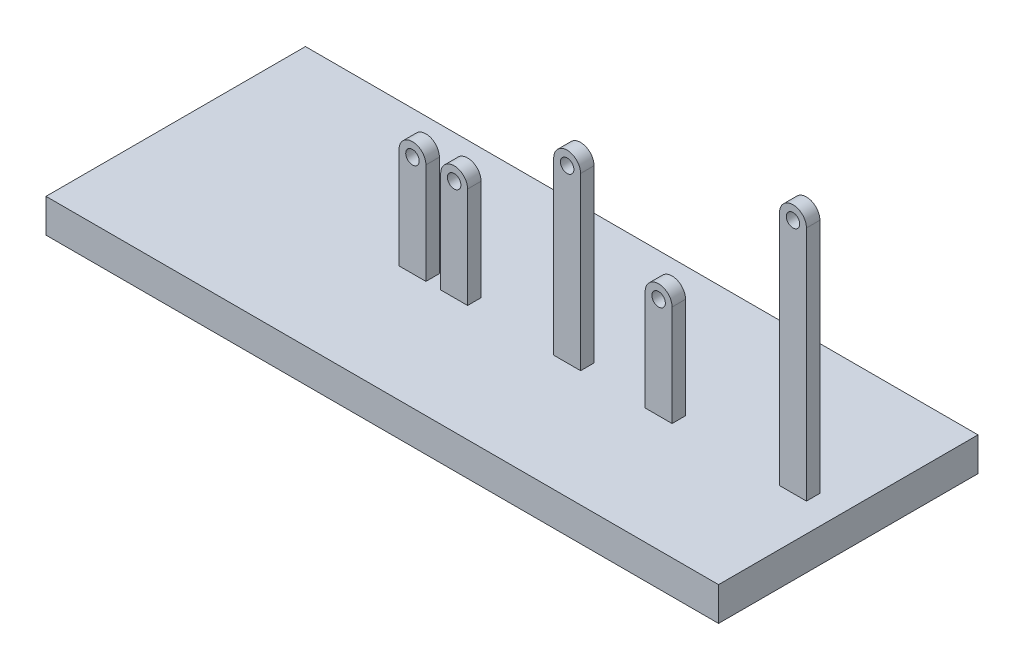
ISO-10303-21;
HEADER;
FILE_DESCRIPTION(('STEP AP214'),'2;1');
FILE_NAME('part.step','',(''),(''),'','','');
FILE_SCHEMA(('AUTOMOTIVE_DESIGN { 1 0 10303 214 1 1 1 1 }'));
ENDSEC;
DATA;
#1=APPLICATION_CONTEXT('core data for automotive mechanical design processes');
#2=APPLICATION_PROTOCOL_DEFINITION('international standard','automotive_design',2000,#1);
#3=PRODUCT_CONTEXT('',#1,'mechanical');
#4=PRODUCT('Part','Part','',(#3));
#5=PRODUCT_RELATED_PRODUCT_CATEGORY('part','',(#4));
#6=PRODUCT_DEFINITION_FORMATION('','',#4);
#7=PRODUCT_DEFINITION_CONTEXT('part definition',#1,'design');
#8=PRODUCT_DEFINITION('design','',#6,#7);
#9=PRODUCT_DEFINITION_SHAPE('','',#8);
#10=(LENGTH_UNIT() NAMED_UNIT(*) SI_UNIT(.MILLI.,.METRE.));
#11=(NAMED_UNIT(*) PLANE_ANGLE_UNIT() SI_UNIT($,.RADIAN.));
#12=(NAMED_UNIT(*) SI_UNIT($,.STERADIAN.) SOLID_ANGLE_UNIT());
#13=UNCERTAINTY_MEASURE_WITH_UNIT(LENGTH_MEASURE(1.E-05),#10,'distance_accuracy_value','');
#14=(GEOMETRIC_REPRESENTATION_CONTEXT(3) GLOBAL_UNCERTAINTY_ASSIGNED_CONTEXT((#13)) GLOBAL_UNIT_ASSIGNED_CONTEXT((#10,
#11,#12)) REPRESENTATION_CONTEXT('',''));
#15=CARTESIAN_POINT('',(0.,0.,0.));
#16=DIRECTION('',(0.,0.,1.));
#17=DIRECTION('',(1.,0.,0.));
#18=AXIS2_PLACEMENT_3D('',#15,#16,#17);
#19=CARTESIAN_POINT('',(0.,5.,0.));
#20=DIRECTION('',(0.,1.,0.));
#21=DIRECTION('',(0.,0.,1.));
#22=AXIS2_PLACEMENT_3D('',#19,#20,#21);
#23=PLANE('',#22);
#24=DIRECTION('',(0.,0.,1.));
#25=VECTOR('',#24,1.);
#26=CARTESIAN_POINT('',(-50.,5.,19.2879926320768));
#27=LINE('',#26,#25);
#28=CARTESIAN_POINT('',(-50.,5.,-19.2879926320768));
#29=VERTEX_POINT('',#28);
#30=CARTESIAN_POINT('',(-50.,5.,19.2879926320768));
#31=VERTEX_POINT('',#30);
#32=EDGE_CURVE('E390',#29,#31,#27,.T.);
#33=ORIENTED_EDGE('',*,*,#32,.T.);
#34=DIRECTION('',(1.,0.,0.));
#35=VECTOR('',#34,1.);
#36=CARTESIAN_POINT('',(50.,5.,19.2879926320768));
#37=LINE('',#36,#35);
#38=CARTESIAN_POINT('',(50.,5.,19.2879926320768));
#39=VERTEX_POINT('',#38);
#40=EDGE_CURVE('E393',#31,#39,#37,.T.);
#41=ORIENTED_EDGE('',*,*,#40,.T.);
#42=DIRECTION('',(0.,0.,-1.));
#43=VECTOR('',#42,1.);
#44=CARTESIAN_POINT('',(50.,5.,19.2879926320768));
#45=LINE('',#44,#43);
#46=CARTESIAN_POINT('',(50.,5.,-19.2879926320768));
#47=VERTEX_POINT('',#46);
#48=EDGE_CURVE('E396',#39,#47,#45,.T.);
#49=ORIENTED_EDGE('',*,*,#48,.T.);
#50=DIRECTION('',(-1.,0.,0.));
#51=VECTOR('',#50,1.);
#52=CARTESIAN_POINT('',(50.,5.,-19.2879926320768));
#53=LINE('',#52,#51);
#54=EDGE_CURVE('E398',#47,#29,#53,.T.);
#55=ORIENTED_EDGE('',*,*,#54,.T.);
#56=EDGE_LOOP('',(#33,#41,#49,#55));
#57=FACE_BOUND('',#56,.T.);
#58=DIRECTION('',(1.,0.,0.));
#59=VECTOR('',#58,1.);
#60=CARTESIAN_POINT('',(0.,5.,2.));
#61=LINE('',#60,#59);
#62=CARTESIAN_POINT('',(-8.6,5.,2.));
#63=VERTEX_POINT('',#62);
#64=CARTESIAN_POINT('',(-4.6,5.,2.));
#65=VERTEX_POINT('',#64);
#66=EDGE_CURVE('E386',#63,#65,#61,.T.);
#67=ORIENTED_EDGE('',*,*,#66,.F.);
#68=DIRECTION('',(0.,0.,-1.));
#69=VECTOR('',#68,1.);
#70=CARTESIAN_POINT('',(-8.6,5.,0.));
#71=LINE('',#70,#69);
#72=CARTESIAN_POINT('',(-8.6,5.,0.));
#73=VERTEX_POINT('',#72);
#74=EDGE_CURVE('E380',#63,#73,#71,.T.);
#75=ORIENTED_EDGE('',*,*,#74,.T.);
#76=DIRECTION('',(1.,0.,0.));
#77=VECTOR('',#76,1.);
#78=CARTESIAN_POINT('',(0.,5.,0.));
#79=LINE('',#78,#77);
#80=CARTESIAN_POINT('',(-4.6,5.,0.));
#81=VERTEX_POINT('',#80);
#82=EDGE_CURVE('E383',#73,#81,#79,.T.);
#83=ORIENTED_EDGE('',*,*,#82,.T.);
#84=DIRECTION('',(0.,0.,1.));
#85=VECTOR('',#84,1.);
#86=CARTESIAN_POINT('',(-4.6,5.,0.));
#87=LINE('',#86,#85);
#88=EDGE_CURVE('E377',#81,#65,#87,.T.);
#89=ORIENTED_EDGE('',*,*,#88,.T.);
#90=EDGE_LOOP('',(#67,#75,#83,#89));
#91=FACE_BOUND('',#90,.T.);
#92=DIRECTION('',(1.,0.,0.));
#93=VECTOR('',#92,1.);
#94=CARTESIAN_POINT('',(0.,5.,2.));
#95=LINE('',#94,#93);
#96=CARTESIAN_POINT('',(-14.8,5.,2.));
#97=VERTEX_POINT('',#96);
#98=CARTESIAN_POINT('',(-10.8,5.,2.));
#99=VERTEX_POINT('',#98);
#100=EDGE_CURVE('E346',#97,#99,#95,.T.);
#101=ORIENTED_EDGE('',*,*,#100,.F.);
#102=DIRECTION('',(0.,0.,-1.));
#103=VECTOR('',#102,1.);
#104=CARTESIAN_POINT('',(-14.8,5.,0.));
#105=LINE('',#104,#103);
#106=CARTESIAN_POINT('',(-14.8,5.,0.));
#107=VERTEX_POINT('',#106);
#108=EDGE_CURVE('E340',#97,#107,#105,.T.);
#109=ORIENTED_EDGE('',*,*,#108,.T.);
#110=DIRECTION('',(1.,0.,0.));
#111=VECTOR('',#110,1.);
#112=CARTESIAN_POINT('',(0.,5.,0.));
#113=LINE('',#112,#111);
#114=CARTESIAN_POINT('',(-10.8,5.,0.));
#115=VERTEX_POINT('',#114);
#116=EDGE_CURVE('E343',#107,#115,#113,.T.);
#117=ORIENTED_EDGE('',*,*,#116,.T.);
#118=DIRECTION('',(0.,0.,1.));
#119=VECTOR('',#118,1.);
#120=CARTESIAN_POINT('',(-10.8,5.,0.));
#121=LINE('',#120,#119);
#122=EDGE_CURVE('E337',#115,#99,#121,.T.);
#123=ORIENTED_EDGE('',*,*,#122,.T.);
#124=EDGE_LOOP('',(#101,#109,#117,#123));
#125=FACE_BOUND('',#124,.T.);
#126=DIRECTION('',(1.,0.,0.));
#127=VECTOR('',#126,1.);
#128=CARTESIAN_POINT('',(0.,5.,2.));
#129=LINE('',#128,#127);
#130=CARTESIAN_POINT('',(21.8,5.,2.));
#131=VERTEX_POINT('',#130);
#132=CARTESIAN_POINT('',(25.8,5.,2.));
#133=VERTEX_POINT('',#132);
#134=EDGE_CURVE('E306',#131,#133,#129,.T.);
#135=ORIENTED_EDGE('',*,*,#134,.F.);
#136=DIRECTION('',(0.,0.,-1.));
#137=VECTOR('',#136,1.);
#138=CARTESIAN_POINT('',(21.8,5.,0.));
#139=LINE('',#138,#137);
#140=CARTESIAN_POINT('',(21.8,5.,0.));
#141=VERTEX_POINT('',#140);
#142=EDGE_CURVE('E300',#131,#141,#139,.T.);
#143=ORIENTED_EDGE('',*,*,#142,.T.);
#144=DIRECTION('',(1.,0.,0.));
#145=VECTOR('',#144,1.);
#146=CARTESIAN_POINT('',(0.,5.,0.));
#147=LINE('',#146,#145);
#148=CARTESIAN_POINT('',(25.8,5.,0.));
#149=VERTEX_POINT('',#148);
#150=EDGE_CURVE('E303',#141,#149,#147,.T.);
#151=ORIENTED_EDGE('',*,*,#150,.T.);
#152=DIRECTION('',(0.,0.,1.));
#153=VECTOR('',#152,1.);
#154=CARTESIAN_POINT('',(25.8,5.,0.));
#155=LINE('',#154,#153);
#156=EDGE_CURVE('E297',#149,#133,#155,.T.);
#157=ORIENTED_EDGE('',*,*,#156,.T.);
#158=EDGE_LOOP('',(#135,#143,#151,#157));
#159=FACE_BOUND('',#158,.T.);
#160=DIRECTION('',(1.,0.,0.));
#161=VECTOR('',#160,1.);
#162=CARTESIAN_POINT('',(0.,5.,2.));
#163=LINE('',#162,#161);
#164=CARTESIAN_POINT('',(8.2,5.,2.));
#165=VERTEX_POINT('',#164);
#166=CARTESIAN_POINT('',(12.2,5.,2.));
#167=VERTEX_POINT('',#166);
#168=EDGE_CURVE('E267',#165,#167,#163,.T.);
#169=ORIENTED_EDGE('',*,*,#168,.F.);
#170=DIRECTION('',(0.,0.,-1.));
#171=VECTOR('',#170,1.);
#172=CARTESIAN_POINT('',(8.2,5.,0.));
#173=LINE('',#172,#171);
#174=CARTESIAN_POINT('',(8.2,5.,0.));
#175=VERTEX_POINT('',#174);
#176=EDGE_CURVE('E261',#165,#175,#173,.T.);
#177=ORIENTED_EDGE('',*,*,#176,.T.);
#178=DIRECTION('',(1.,0.,0.));
#179=VECTOR('',#178,1.);
#180=CARTESIAN_POINT('',(0.,5.,0.));
#181=LINE('',#180,#179);
#182=CARTESIAN_POINT('',(12.2,5.,0.));
#183=VERTEX_POINT('',#182);
#184=EDGE_CURVE('E264',#175,#183,#181,.T.);
#185=ORIENTED_EDGE('',*,*,#184,.T.);
#186=DIRECTION('',(0.,0.,1.));
#187=VECTOR('',#186,1.);
#188=CARTESIAN_POINT('',(12.2,5.,0.));
#189=LINE('',#188,#187);
#190=EDGE_CURVE('E258',#183,#167,#189,.T.);
#191=ORIENTED_EDGE('',*,*,#190,.T.);
#192=EDGE_LOOP('',(#169,#177,#185,#191));
#193=FACE_BOUND('',#192,.T.);
#194=DIRECTION('',(1.,0.,0.));
#195=VECTOR('',#194,1.);
#196=CARTESIAN_POINT('',(0.,5.,2.));
#197=LINE('',#196,#195);
#198=CARTESIAN_POINT('',(41.78,5.,2.));
#199=VERTEX_POINT('',#198);
#200=CARTESIAN_POINT('',(45.78,5.,2.));
#201=VERTEX_POINT('',#200);
#202=EDGE_CURVE('E229',#199,#201,#197,.T.);
#203=ORIENTED_EDGE('',*,*,#202,.F.);
#204=DIRECTION('',(0.,0.,-1.));
#205=VECTOR('',#204,1.);
#206=CARTESIAN_POINT('',(41.78,5.,0.));
#207=LINE('',#206,#205);
#208=CARTESIAN_POINT('',(41.78,5.,0.));
#209=VERTEX_POINT('',#208);
#210=EDGE_CURVE('E202',#199,#209,#207,.T.);
#211=ORIENTED_EDGE('',*,*,#210,.T.);
#212=DIRECTION('',(1.,0.,0.));
#213=VECTOR('',#212,1.);
#214=CARTESIAN_POINT('',(0.,5.,0.));
#215=LINE('',#214,#213);
#216=CARTESIAN_POINT('',(45.78,5.,0.));
#217=VERTEX_POINT('',#216);
#218=EDGE_CURVE('E226',#209,#217,#215,.T.);
#219=ORIENTED_EDGE('',*,*,#218,.T.);
#220=DIRECTION('',(0.,0.,1.));
#221=VECTOR('',#220,1.);
#222=CARTESIAN_POINT('',(45.78,5.,0.));
#223=LINE('',#222,#221);
#224=EDGE_CURVE('E217',#217,#201,#223,.T.);
#225=ORIENTED_EDGE('',*,*,#224,.T.);
#226=EDGE_LOOP('',(#203,#211,#219,#225));
#227=FACE_BOUND('',#226,.T.);
#228=ADVANCED_FACE('F33',(#57,#91,#125,#159,#193,#227),#23,.T.);
#229=CARTESIAN_POINT('',(-50.,5.,19.2879926320768));
#230=DIRECTION('',(1.,0.,0.));
#231=DIRECTION('',(0.,0.,-1.));
#232=AXIS2_PLACEMENT_3D('',#229,#230,#231);
#233=PLANE('',#232);
#234=DIRECTION('',(0.,0.,1.));
#235=VECTOR('',#234,1.);
#236=CARTESIAN_POINT('',(-50.,0.,19.2879926320768));
#237=LINE('',#236,#235);
#238=CARTESIAN_POINT('',(-50.,0.,-19.2879926320768));
#239=VERTEX_POINT('',#238);
#240=CARTESIAN_POINT('',(-50.,0.,19.2879926320768));
#241=VERTEX_POINT('',#240);
#242=EDGE_CURVE('E389',#239,#241,#237,.T.);
#243=ORIENTED_EDGE('',*,*,#242,.T.);
#244=DIRECTION('',(0.,-1.,0.));
#245=VECTOR('',#244,1.);
#246=CARTESIAN_POINT('',(-50.,5.,19.2879926320768));
#247=LINE('',#246,#245);
#248=EDGE_CURVE('E11',#31,#241,#247,.T.);
#249=ORIENTED_EDGE('',*,*,#248,.F.);
#250=ORIENTED_EDGE('',*,*,#32,.F.);
#251=DIRECTION('',(0.,-1.,0.));
#252=VECTOR('',#251,1.);
#253=CARTESIAN_POINT('',(-50.,5.,-19.2879926320768));
#254=LINE('',#253,#252);
#255=EDGE_CURVE('E400',#29,#239,#254,.T.);
#256=ORIENTED_EDGE('',*,*,#255,.T.);
#257=EDGE_LOOP('',(#243,#249,#250,#256));
#258=FACE_BOUND('',#257,.T.);
#259=ADVANCED_FACE('F35',(#258),#233,.F.);
#260=CARTESIAN_POINT('',(50.,5.,19.2879926320768));
#261=DIRECTION('',(0.,0.,-1.));
#262=DIRECTION('',(-1.,0.,0.));
#263=AXIS2_PLACEMENT_3D('',#260,#261,#262);
#264=PLANE('',#263);
#265=DIRECTION('',(1.,0.,0.));
#266=VECTOR('',#265,1.);
#267=CARTESIAN_POINT('',(50.,0.,19.2879926320768));
#268=LINE('',#267,#266);
#269=CARTESIAN_POINT('',(50.,0.,19.2879926320768));
#270=VERTEX_POINT('',#269);
#271=EDGE_CURVE('E403',#241,#270,#268,.T.);
#272=ORIENTED_EDGE('',*,*,#271,.T.);
#273=DIRECTION('',(0.,-1.,0.));
#274=VECTOR('',#273,1.);
#275=CARTESIAN_POINT('',(50.,5.,19.2879926320768));
#276=LINE('',#275,#274);
#277=EDGE_CURVE('E41',#39,#270,#276,.T.);
#278=ORIENTED_EDGE('',*,*,#277,.F.);
#279=ORIENTED_EDGE('',*,*,#40,.F.);
#280=ORIENTED_EDGE('',*,*,#248,.T.);
#281=EDGE_LOOP('',(#272,#278,#279,#280));
#282=FACE_BOUND('',#281,.T.);
#283=ADVANCED_FACE('F433',(#282),#264,.F.);
#284=CARTESIAN_POINT('',(50.,5.,19.2879926320768));
#285=DIRECTION('',(-1.,0.,0.));
#286=DIRECTION('',(0.,0.,1.));
#287=AXIS2_PLACEMENT_3D('',#284,#285,#286);
#288=PLANE('',#287);
#289=DIRECTION('',(0.,0.,-1.));
#290=VECTOR('',#289,1.);
#291=CARTESIAN_POINT('',(50.,0.,19.2879926320768));
#292=LINE('',#291,#290);
#293=CARTESIAN_POINT('',(50.,0.,-19.2879926320768));
#294=VERTEX_POINT('',#293);
#295=EDGE_CURVE('E405',#270,#294,#292,.T.);
#296=ORIENTED_EDGE('',*,*,#295,.T.);
#297=DIRECTION('',(0.,-1.,0.));
#298=VECTOR('',#297,1.);
#299=CARTESIAN_POINT('',(50.,5.,-19.2879926320768));
#300=LINE('',#299,#298);
#301=EDGE_CURVE('E410',#47,#294,#300,.T.);
#302=ORIENTED_EDGE('',*,*,#301,.F.);
#303=ORIENTED_EDGE('',*,*,#48,.F.);
#304=ORIENTED_EDGE('',*,*,#277,.T.);
#305=EDGE_LOOP('',(#296,#302,#303,#304));
#306=FACE_BOUND('',#305,.T.);
#307=ADVANCED_FACE('F417',(#306),#288,.F.);
#308=CARTESIAN_POINT('',(50.,5.,-19.2879926320768));
#309=DIRECTION('',(0.,0.,1.));
#310=DIRECTION('',(1.,0.,0.));
#311=AXIS2_PLACEMENT_3D('',#308,#309,#310);
#312=PLANE('',#311);
#313=DIRECTION('',(-1.,0.,0.));
#314=VECTOR('',#313,1.);
#315=CARTESIAN_POINT('',(50.,0.,-19.2879926320768));
#316=LINE('',#315,#314);
#317=EDGE_CURVE('E394',#294,#239,#316,.T.);
#318=ORIENTED_EDGE('',*,*,#317,.T.);
#319=ORIENTED_EDGE('',*,*,#255,.F.);
#320=ORIENTED_EDGE('',*,*,#54,.F.);
#321=ORIENTED_EDGE('',*,*,#301,.T.);
#322=EDGE_LOOP('',(#318,#319,#320,#321));
#323=FACE_BOUND('',#322,.T.);
#324=ADVANCED_FACE('F426',(#323),#312,.F.);
#325=CARTESIAN_POINT('',(0.,0.,0.));
#326=DIRECTION('',(0.,1.,0.));
#327=DIRECTION('',(0.,0.,1.));
#328=AXIS2_PLACEMENT_3D('',#325,#326,#327);
#329=PLANE('',#328);
#330=ORIENTED_EDGE('',*,*,#242,.F.);
#331=ORIENTED_EDGE('',*,*,#317,.F.);
#332=ORIENTED_EDGE('',*,*,#295,.F.);
#333=ORIENTED_EDGE('',*,*,#271,.F.);
#334=EDGE_LOOP('',(#330,#331,#332,#333));
#335=FACE_BOUND('',#334,.T.);
#336=ADVANCED_FACE('F423',(#335),#329,.F.);
#337=CARTESIAN_POINT('',(-6.6,20.,2.));
#338=DIRECTION('',(0.,0.,1.));
#339=DIRECTION('',(1.,0.,0.));
#340=AXIS2_PLACEMENT_3D('',#337,#338,#339);
#341=PLANE('',#340);
#342=DIRECTION('',(0.,-1.,0.));
#343=VECTOR('',#342,1.);
#344=CARTESIAN_POINT('',(-8.6,20.,2.));
#345=LINE('',#344,#343);
#346=CARTESIAN_POINT('',(-8.6,20.,2.));
#347=VERTEX_POINT('',#346);
#348=EDGE_CURVE('E359',#347,#63,#345,.T.);
#349=ORIENTED_EDGE('',*,*,#348,.T.);
#350=ORIENTED_EDGE('',*,*,#66,.T.);
#351=DIRECTION('',(0.,1.,0.));
#352=VECTOR('',#351,1.);
#353=CARTESIAN_POINT('',(-4.6,20.,2.));
#354=LINE('',#353,#352);
#355=CARTESIAN_POINT('',(-4.6,20.,2.));
#356=VERTEX_POINT('',#355);
#357=EDGE_CURVE('E363',#65,#356,#354,.T.);
#358=ORIENTED_EDGE('',*,*,#357,.T.);
#359=CARTESIAN_POINT('',(-6.6,20.,2.));
#360=DIRECTION('',(0.,0.,1.));
#361=DIRECTION('',(1.,0.,0.));
#362=AXIS2_PLACEMENT_3D('',#359,#360,#361);
#363=CIRCLE('',#362,2.);
#364=EDGE_CURVE('E356',#356,#347,#363,.T.);
#365=ORIENTED_EDGE('',*,*,#364,.T.);
#366=EDGE_LOOP('',(#349,#350,#358,#365));
#367=FACE_BOUND('',#366,.T.);
#368=CARTESIAN_POINT('',(-6.6,20.,2.));
#369=DIRECTION('',(0.,0.,1.));
#370=DIRECTION('',(1.,0.,0.));
#371=AXIS2_PLACEMENT_3D('',#368,#369,#370);
#372=CIRCLE('',#371,1.);
#373=CARTESIAN_POINT('',(-5.6,20.,2.));
#374=VERTEX_POINT('',#373);
#375=EDGE_CURVE('E350',#374,#374,#372,.T.);
#376=ORIENTED_EDGE('',*,*,#375,.F.);
#377=EDGE_LOOP('',(#376));
#378=FACE_BOUND('',#377,.T.);
#379=ADVANCED_FACE('F450',(#367,#378),#341,.T.);
#380=CARTESIAN_POINT('',(-6.6,20.,0.));
#381=DIRECTION('',(0.,0.,1.));
#382=DIRECTION('',(1.,0.,0.));
#383=AXIS2_PLACEMENT_3D('',#380,#381,#382);
#384=PLANE('',#383);
#385=ORIENTED_EDGE('',*,*,#82,.F.);
#386=DIRECTION('',(0.,-1.,0.));
#387=VECTOR('',#386,1.);
#388=CARTESIAN_POINT('',(-8.6,20.,0.));
#389=LINE('',#388,#387);
#390=CARTESIAN_POINT('',(-8.6,20.,0.));
#391=VERTEX_POINT('',#390);
#392=EDGE_CURVE('E368',#391,#73,#389,.T.);
#393=ORIENTED_EDGE('',*,*,#392,.F.);
#394=CARTESIAN_POINT('',(-6.6,20.,0.));
#395=DIRECTION('',(0.,0.,1.));
#396=DIRECTION('',(1.,0.,0.));
#397=AXIS2_PLACEMENT_3D('',#394,#395,#396);
#398=CIRCLE('',#397,2.);
#399=CARTESIAN_POINT('',(-4.6,20.,0.));
#400=VERTEX_POINT('',#399);
#401=EDGE_CURVE('E353',#400,#391,#398,.T.);
#402=ORIENTED_EDGE('',*,*,#401,.F.);
#403=DIRECTION('',(0.,1.,0.));
#404=VECTOR('',#403,1.);
#405=CARTESIAN_POINT('',(-4.6,20.,0.));
#406=LINE('',#405,#404);
#407=EDGE_CURVE('E360',#81,#400,#406,.T.);
#408=ORIENTED_EDGE('',*,*,#407,.F.);
#409=EDGE_LOOP('',(#385,#393,#402,#408));
#410=FACE_BOUND('',#409,.T.);
#411=CARTESIAN_POINT('',(-6.6,20.,0.));
#412=DIRECTION('',(0.,0.,1.));
#413=DIRECTION('',(1.,0.,0.));
#414=AXIS2_PLACEMENT_3D('',#411,#412,#413);
#415=CIRCLE('',#414,1.);
#416=CARTESIAN_POINT('',(-5.6,20.,0.));
#417=VERTEX_POINT('',#416);
#418=EDGE_CURVE('E349',#417,#417,#415,.T.);
#419=ORIENTED_EDGE('',*,*,#418,.T.);
#420=EDGE_LOOP('',(#419));
#421=FACE_BOUND('',#420,.T.);
#422=ADVANCED_FACE('F466',(#410,#421),#384,.F.);
#423=CARTESIAN_POINT('',(-6.6,20.,2.));
#424=DIRECTION('',(0.,0.,-1.));
#425=DIRECTION('',(-1.,0.,0.));
#426=AXIS2_PLACEMENT_3D('',#423,#424,#425);
#427=CYLINDRICAL_SURFACE('',#426,2.);
#428=ORIENTED_EDGE('',*,*,#401,.T.);
#429=DIRECTION('',(0.,0.,-1.));
#430=VECTOR('',#429,1.);
#431=CARTESIAN_POINT('',(-8.6,20.,2.));
#432=LINE('',#431,#430);
#433=EDGE_CURVE('E374',#347,#391,#432,.T.);
#434=ORIENTED_EDGE('',*,*,#433,.F.);
#435=ORIENTED_EDGE('',*,*,#364,.F.);
#436=DIRECTION('',(0.,0.,-1.));
#437=VECTOR('',#436,1.);
#438=CARTESIAN_POINT('',(-4.6,20.,2.));
#439=LINE('',#438,#437);
#440=EDGE_CURVE('E365',#356,#400,#439,.T.);
#441=ORIENTED_EDGE('',*,*,#440,.T.);
#442=EDGE_LOOP('',(#428,#434,#435,#441));
#443=FACE_BOUND('',#442,.T.);
#444=ADVANCED_FACE('F446',(#443),#427,.T.);
#445=CARTESIAN_POINT('',(-8.6,20.,2.));
#446=DIRECTION('',(1.,0.,0.));
#447=DIRECTION('',(0.,1.,0.));
#448=AXIS2_PLACEMENT_3D('',#445,#446,#447);
#449=PLANE('',#448);
#450=ORIENTED_EDGE('',*,*,#74,.F.);
#451=ORIENTED_EDGE('',*,*,#348,.F.);
#452=ORIENTED_EDGE('',*,*,#433,.T.);
#453=ORIENTED_EDGE('',*,*,#392,.T.);
#454=EDGE_LOOP('',(#450,#451,#452,#453));
#455=FACE_BOUND('',#454,.T.);
#456=ADVANCED_FACE('F481',(#455),#449,.F.);
#457=CARTESIAN_POINT('',(-4.6,20.,2.));
#458=DIRECTION('',(-1.,0.,0.));
#459=DIRECTION('',(0.,-1.,0.));
#460=AXIS2_PLACEMENT_3D('',#457,#458,#459);
#461=PLANE('',#460);
#462=ORIENTED_EDGE('',*,*,#88,.F.);
#463=ORIENTED_EDGE('',*,*,#407,.T.);
#464=ORIENTED_EDGE('',*,*,#440,.F.);
#465=ORIENTED_EDGE('',*,*,#357,.F.);
#466=EDGE_LOOP('',(#462,#463,#464,#465));
#467=FACE_BOUND('',#466,.T.);
#468=ADVANCED_FACE('F488',(#467),#461,.F.);
#469=CARTESIAN_POINT('',(-6.6,20.,2.));
#470=DIRECTION('',(0.,0.,-1.));
#471=DIRECTION('',(-1.,0.,0.));
#472=AXIS2_PLACEMENT_3D('',#469,#470,#471);
#473=CYLINDRICAL_SURFACE('',#472,1.);
#474=ORIENTED_EDGE('',*,*,#375,.T.);
#475=EDGE_LOOP('',(#474));
#476=FACE_BOUND('',#475,.T.);
#477=ORIENTED_EDGE('',*,*,#418,.F.);
#478=EDGE_LOOP('',(#477));
#479=FACE_BOUND('',#478,.T.);
#480=ADVANCED_FACE('F495',(#476,#479),#473,.F.);
#481=CARTESIAN_POINT('',(-12.8,20.,2.));
#482=DIRECTION('',(0.,0.,1.));
#483=DIRECTION('',(1.,0.,0.));
#484=AXIS2_PLACEMENT_3D('',#481,#482,#483);
#485=PLANE('',#484);
#486=DIRECTION('',(0.,-1.,0.));
#487=VECTOR('',#486,1.);
#488=CARTESIAN_POINT('',(-14.8,20.,2.));
#489=LINE('',#488,#487);
#490=CARTESIAN_POINT('',(-14.8,20.,2.));
#491=VERTEX_POINT('',#490);
#492=EDGE_CURVE('E319',#491,#97,#489,.T.);
#493=ORIENTED_EDGE('',*,*,#492,.T.);
#494=ORIENTED_EDGE('',*,*,#100,.T.);
#495=DIRECTION('',(0.,1.,0.));
#496=VECTOR('',#495,1.);
#497=CARTESIAN_POINT('',(-10.8,20.,2.));
#498=LINE('',#497,#496);
#499=CARTESIAN_POINT('',(-10.8,20.,2.));
#500=VERTEX_POINT('',#499);
#501=EDGE_CURVE('E323',#99,#500,#498,.T.);
#502=ORIENTED_EDGE('',*,*,#501,.T.);
#503=CARTESIAN_POINT('',(-12.8,20.,2.));
#504=DIRECTION('',(0.,0.,1.));
#505=DIRECTION('',(1.,0.,0.));
#506=AXIS2_PLACEMENT_3D('',#503,#504,#505);
#507=CIRCLE('',#506,2.);
#508=EDGE_CURVE('E316',#500,#491,#507,.T.);
#509=ORIENTED_EDGE('',*,*,#508,.T.);
#510=EDGE_LOOP('',(#493,#494,#502,#509));
#511=FACE_BOUND('',#510,.T.);
#512=CARTESIAN_POINT('',(-12.8,20.,2.));
#513=DIRECTION('',(0.,0.,1.));
#514=DIRECTION('',(1.,0.,0.));
#515=AXIS2_PLACEMENT_3D('',#512,#513,#514);
#516=CIRCLE('',#515,1.);
#517=CARTESIAN_POINT('',(-11.8,20.,2.));
#518=VERTEX_POINT('',#517);
#519=EDGE_CURVE('E310',#518,#518,#516,.T.);
#520=ORIENTED_EDGE('',*,*,#519,.F.);
#521=EDGE_LOOP('',(#520));
#522=FACE_BOUND('',#521,.T.);
#523=ADVANCED_FACE('F503',(#511,#522),#485,.T.);
#524=CARTESIAN_POINT('',(-12.8,20.,0.));
#525=DIRECTION('',(0.,0.,1.));
#526=DIRECTION('',(1.,0.,0.));
#527=AXIS2_PLACEMENT_3D('',#524,#525,#526);
#528=PLANE('',#527);
#529=ORIENTED_EDGE('',*,*,#116,.F.);
#530=DIRECTION('',(0.,-1.,0.));
#531=VECTOR('',#530,1.);
#532=CARTESIAN_POINT('',(-14.8,20.,0.));
#533=LINE('',#532,#531);
#534=CARTESIAN_POINT('',(-14.8,20.,0.));
#535=VERTEX_POINT('',#534);
#536=EDGE_CURVE('E328',#535,#107,#533,.T.);
#537=ORIENTED_EDGE('',*,*,#536,.F.);
#538=CARTESIAN_POINT('',(-12.8,20.,0.));
#539=DIRECTION('',(0.,0.,1.));
#540=DIRECTION('',(1.,0.,0.));
#541=AXIS2_PLACEMENT_3D('',#538,#539,#540);
#542=CIRCLE('',#541,2.);
#543=CARTESIAN_POINT('',(-10.8,20.,0.));
#544=VERTEX_POINT('',#543);
#545=EDGE_CURVE('E313',#544,#535,#542,.T.);
#546=ORIENTED_EDGE('',*,*,#545,.F.);
#547=DIRECTION('',(0.,1.,0.));
#548=VECTOR('',#547,1.);
#549=CARTESIAN_POINT('',(-10.8,20.,0.));
#550=LINE('',#549,#548);
#551=EDGE_CURVE('E320',#115,#544,#550,.T.);
#552=ORIENTED_EDGE('',*,*,#551,.F.);
#553=EDGE_LOOP('',(#529,#537,#546,#552));
#554=FACE_BOUND('',#553,.T.);
#555=CARTESIAN_POINT('',(-12.8,20.,0.));
#556=DIRECTION('',(0.,0.,1.));
#557=DIRECTION('',(1.,0.,0.));
#558=AXIS2_PLACEMENT_3D('',#555,#556,#557);
#559=CIRCLE('',#558,1.);
#560=CARTESIAN_POINT('',(-11.8,20.,0.));
#561=VERTEX_POINT('',#560);
#562=EDGE_CURVE('E309',#561,#561,#559,.T.);
#563=ORIENTED_EDGE('',*,*,#562,.T.);
#564=EDGE_LOOP('',(#563));
#565=FACE_BOUND('',#564,.T.);
#566=ADVANCED_FACE('F511',(#554,#565),#528,.F.);
#567=CARTESIAN_POINT('',(-12.8,20.,2.));
#568=DIRECTION('',(0.,0.,-1.));
#569=DIRECTION('',(-1.,0.,0.));
#570=AXIS2_PLACEMENT_3D('',#567,#568,#569);
#571=CYLINDRICAL_SURFACE('',#570,2.);
#572=ORIENTED_EDGE('',*,*,#545,.T.);
#573=DIRECTION('',(0.,0.,-1.));
#574=VECTOR('',#573,1.);
#575=CARTESIAN_POINT('',(-14.8,20.,2.));
#576=LINE('',#575,#574);
#577=EDGE_CURVE('E334',#491,#535,#576,.T.);
#578=ORIENTED_EDGE('',*,*,#577,.F.);
#579=ORIENTED_EDGE('',*,*,#508,.F.);
#580=DIRECTION('',(0.,0.,-1.));
#581=VECTOR('',#580,1.);
#582=CARTESIAN_POINT('',(-10.8,20.,2.));
#583=LINE('',#582,#581);
#584=EDGE_CURVE('E325',#500,#544,#583,.T.);
#585=ORIENTED_EDGE('',*,*,#584,.T.);
#586=EDGE_LOOP('',(#572,#578,#579,#585));
#587=FACE_BOUND('',#586,.T.);
#588=ADVANCED_FACE('F519',(#587),#571,.T.);
#589=CARTESIAN_POINT('',(-14.8,20.,2.));
#590=DIRECTION('',(1.,0.,0.));
#591=DIRECTION('',(0.,1.,0.));
#592=AXIS2_PLACEMENT_3D('',#589,#590,#591);
#593=PLANE('',#592);
#594=ORIENTED_EDGE('',*,*,#108,.F.);
#595=ORIENTED_EDGE('',*,*,#492,.F.);
#596=ORIENTED_EDGE('',*,*,#577,.T.);
#597=ORIENTED_EDGE('',*,*,#536,.T.);
#598=EDGE_LOOP('',(#594,#595,#596,#597));
#599=FACE_BOUND('',#598,.T.);
#600=ADVANCED_FACE('F527',(#599),#593,.F.);
#601=CARTESIAN_POINT('',(-10.8,20.,2.));
#602=DIRECTION('',(-1.,0.,0.));
#603=DIRECTION('',(0.,-1.,0.));
#604=AXIS2_PLACEMENT_3D('',#601,#602,#603);
#605=PLANE('',#604);
#606=ORIENTED_EDGE('',*,*,#122,.F.);
#607=ORIENTED_EDGE('',*,*,#551,.T.);
#608=ORIENTED_EDGE('',*,*,#584,.F.);
#609=ORIENTED_EDGE('',*,*,#501,.F.);
#610=EDGE_LOOP('',(#606,#607,#608,#609));
#611=FACE_BOUND('',#610,.T.);
#612=ADVANCED_FACE('F535',(#611),#605,.F.);
#613=CARTESIAN_POINT('',(-12.8,20.,2.));
#614=DIRECTION('',(0.,0.,-1.));
#615=DIRECTION('',(-1.,0.,0.));
#616=AXIS2_PLACEMENT_3D('',#613,#614,#615);
#617=CYLINDRICAL_SURFACE('',#616,1.);
#618=ORIENTED_EDGE('',*,*,#519,.T.);
#619=EDGE_LOOP('',(#618));
#620=FACE_BOUND('',#619,.T.);
#621=ORIENTED_EDGE('',*,*,#562,.F.);
#622=EDGE_LOOP('',(#621));
#623=FACE_BOUND('',#622,.T.);
#624=ADVANCED_FACE('F543',(#620,#623),#617,.F.);
#625=CARTESIAN_POINT('',(23.8,20.,2.));
#626=DIRECTION('',(0.,0.,1.));
#627=DIRECTION('',(1.,0.,0.));
#628=AXIS2_PLACEMENT_3D('',#625,#626,#627);
#629=PLANE('',#628);
#630=DIRECTION('',(0.,-1.,0.));
#631=VECTOR('',#630,1.);
#632=CARTESIAN_POINT('',(21.8,20.,2.));
#633=LINE('',#632,#631);
#634=CARTESIAN_POINT('',(21.8,20.,2.));
#635=VERTEX_POINT('',#634);
#636=EDGE_CURVE('E279',#635,#131,#633,.T.);
#637=ORIENTED_EDGE('',*,*,#636,.T.);
#638=ORIENTED_EDGE('',*,*,#134,.T.);
#639=DIRECTION('',(0.,1.,0.));
#640=VECTOR('',#639,1.);
#641=CARTESIAN_POINT('',(25.8,20.,2.));
#642=LINE('',#641,#640);
#643=CARTESIAN_POINT('',(25.8,20.,2.));
#644=VERTEX_POINT('',#643);
#645=EDGE_CURVE('E283',#133,#644,#642,.T.);
#646=ORIENTED_EDGE('',*,*,#645,.T.);
#647=CARTESIAN_POINT('',(23.8,20.,2.));
#648=DIRECTION('',(0.,0.,1.));
#649=DIRECTION('',(1.,0.,0.));
#650=AXIS2_PLACEMENT_3D('',#647,#648,#649);
#651=CIRCLE('',#650,1.99999999999999);
#652=EDGE_CURVE('E276',#644,#635,#651,.T.);
#653=ORIENTED_EDGE('',*,*,#652,.T.);
#654=EDGE_LOOP('',(#637,#638,#646,#653));
#655=FACE_BOUND('',#654,.T.);
#656=CARTESIAN_POINT('',(23.8,20.,2.));
#657=DIRECTION('',(0.,0.,1.));
#658=DIRECTION('',(1.,0.,0.));
#659=AXIS2_PLACEMENT_3D('',#656,#657,#658);
#660=CIRCLE('',#659,0.999999999999998);
#661=CARTESIAN_POINT('',(24.8,20.,2.));
#662=VERTEX_POINT('',#661);
#663=EDGE_CURVE('E270',#662,#662,#660,.T.);
#664=ORIENTED_EDGE('',*,*,#663,.F.);
#665=EDGE_LOOP('',(#664));
#666=FACE_BOUND('',#665,.T.);
#667=ADVANCED_FACE('F551',(#655,#666),#629,.T.);
#668=CARTESIAN_POINT('',(23.8,20.,0.));
#669=DIRECTION('',(0.,0.,1.));
#670=DIRECTION('',(1.,0.,0.));
#671=AXIS2_PLACEMENT_3D('',#668,#669,#670);
#672=PLANE('',#671);
#673=ORIENTED_EDGE('',*,*,#150,.F.);
#674=DIRECTION('',(0.,-1.,0.));
#675=VECTOR('',#674,1.);
#676=CARTESIAN_POINT('',(21.8,20.,0.));
#677=LINE('',#676,#675);
#678=CARTESIAN_POINT('',(21.8,20.,0.));
#679=VERTEX_POINT('',#678);
#680=EDGE_CURVE('E288',#679,#141,#677,.T.);
#681=ORIENTED_EDGE('',*,*,#680,.F.);
#682=CARTESIAN_POINT('',(23.8,20.,0.));
#683=DIRECTION('',(0.,0.,1.));
#684=DIRECTION('',(1.,0.,0.));
#685=AXIS2_PLACEMENT_3D('',#682,#683,#684);
#686=CIRCLE('',#685,1.99999999999999);
#687=CARTESIAN_POINT('',(25.8,20.,0.));
#688=VERTEX_POINT('',#687);
#689=EDGE_CURVE('E273',#688,#679,#686,.T.);
#690=ORIENTED_EDGE('',*,*,#689,.F.);
#691=DIRECTION('',(0.,1.,0.));
#692=VECTOR('',#691,1.);
#693=CARTESIAN_POINT('',(25.8,20.,0.));
#694=LINE('',#693,#692);
#695=EDGE_CURVE('E280',#149,#688,#694,.T.);
#696=ORIENTED_EDGE('',*,*,#695,.F.);
#697=EDGE_LOOP('',(#673,#681,#690,#696));
#698=FACE_BOUND('',#697,.T.);
#699=CARTESIAN_POINT('',(23.8,20.,0.));
#700=DIRECTION('',(0.,0.,1.));
#701=DIRECTION('',(1.,0.,0.));
#702=AXIS2_PLACEMENT_3D('',#699,#700,#701);
#703=CIRCLE('',#702,0.999999999999998);
#704=CARTESIAN_POINT('',(24.8,20.,0.));
#705=VERTEX_POINT('',#704);
#706=EDGE_CURVE('E269',#705,#705,#703,.T.);
#707=ORIENTED_EDGE('',*,*,#706,.T.);
#708=EDGE_LOOP('',(#707));
#709=FACE_BOUND('',#708,.T.);
#710=ADVANCED_FACE('F559',(#698,#709),#672,.F.);
#711=CARTESIAN_POINT('',(23.8,20.,2.));
#712=DIRECTION('',(0.,0.,-1.));
#713=DIRECTION('',(-1.,0.,0.));
#714=AXIS2_PLACEMENT_3D('',#711,#712,#713);
#715=CYLINDRICAL_SURFACE('',#714,1.99999999999999);
#716=ORIENTED_EDGE('',*,*,#689,.T.);
#717=DIRECTION('',(0.,0.,-1.));
#718=VECTOR('',#717,1.);
#719=CARTESIAN_POINT('',(21.8,20.,2.));
#720=LINE('',#719,#718);
#721=EDGE_CURVE('E294',#635,#679,#720,.T.);
#722=ORIENTED_EDGE('',*,*,#721,.F.);
#723=ORIENTED_EDGE('',*,*,#652,.F.);
#724=DIRECTION('',(0.,0.,-1.));
#725=VECTOR('',#724,1.);
#726=CARTESIAN_POINT('',(25.8,20.,2.));
#727=LINE('',#726,#725);
#728=EDGE_CURVE('E285',#644,#688,#727,.T.);
#729=ORIENTED_EDGE('',*,*,#728,.T.);
#730=EDGE_LOOP('',(#716,#722,#723,#729));
#731=FACE_BOUND('',#730,.T.);
#732=ADVANCED_FACE('F567',(#731),#715,.T.);
#733=CARTESIAN_POINT('',(21.8,20.,2.));
#734=DIRECTION('',(1.,0.,0.));
#735=DIRECTION('',(0.,0.,-1.));
#736=AXIS2_PLACEMENT_3D('',#733,#734,#735);
#737=PLANE('',#736);
#738=ORIENTED_EDGE('',*,*,#142,.F.);
#739=ORIENTED_EDGE('',*,*,#636,.F.);
#740=ORIENTED_EDGE('',*,*,#721,.T.);
#741=ORIENTED_EDGE('',*,*,#680,.T.);
#742=EDGE_LOOP('',(#738,#739,#740,#741));
#743=FACE_BOUND('',#742,.T.);
#744=ADVANCED_FACE('F575',(#743),#737,.F.);
#745=CARTESIAN_POINT('',(25.8,20.,2.));
#746=DIRECTION('',(-1.,0.,0.));
#747=DIRECTION('',(0.,-1.,0.));
#748=AXIS2_PLACEMENT_3D('',#745,#746,#747);
#749=PLANE('',#748);
#750=ORIENTED_EDGE('',*,*,#156,.F.);
#751=ORIENTED_EDGE('',*,*,#695,.T.);
#752=ORIENTED_EDGE('',*,*,#728,.F.);
#753=ORIENTED_EDGE('',*,*,#645,.F.);
#754=EDGE_LOOP('',(#750,#751,#752,#753));
#755=FACE_BOUND('',#754,.T.);
#756=ADVANCED_FACE('F583',(#755),#749,.F.);
#757=CARTESIAN_POINT('',(23.8,20.,2.));
#758=DIRECTION('',(0.,0.,-1.));
#759=DIRECTION('',(-1.,0.,0.));
#760=AXIS2_PLACEMENT_3D('',#757,#758,#759);
#761=CYLINDRICAL_SURFACE('',#760,0.999999999999998);
#762=ORIENTED_EDGE('',*,*,#663,.T.);
#763=EDGE_LOOP('',(#762));
#764=FACE_BOUND('',#763,.T.);
#765=ORIENTED_EDGE('',*,*,#706,.F.);
#766=EDGE_LOOP('',(#765));
#767=FACE_BOUND('',#766,.T.);
#768=ADVANCED_FACE('F591',(#764,#767),#761,.F.);
#769=CARTESIAN_POINT('',(10.2,30.4,2.));
#770=DIRECTION('',(0.,0.,1.));
#771=DIRECTION('',(1.,0.,0.));
#772=AXIS2_PLACEMENT_3D('',#769,#770,#771);
#773=PLANE('',#772);
#774=DIRECTION('',(0.,-1.,0.));
#775=VECTOR('',#774,1.);
#776=CARTESIAN_POINT('',(8.2,30.4,2.));
#777=LINE('',#776,#775);
#778=CARTESIAN_POINT('',(8.2,30.4,2.));
#779=VERTEX_POINT('',#778);
#780=EDGE_CURVE('E241',#779,#165,#777,.T.);
#781=ORIENTED_EDGE('',*,*,#780,.T.);
#782=ORIENTED_EDGE('',*,*,#168,.T.);
#783=DIRECTION('',(0.,1.,0.));
#784=VECTOR('',#783,1.);
#785=CARTESIAN_POINT('',(12.2,30.4,2.));
#786=LINE('',#785,#784);
#787=CARTESIAN_POINT('',(12.2,30.4,2.));
#788=VERTEX_POINT('',#787);
#789=EDGE_CURVE('E56',#167,#788,#786,.T.);
#790=ORIENTED_EDGE('',*,*,#789,.T.);
#791=CARTESIAN_POINT('',(10.2,30.4,2.));
#792=DIRECTION('',(0.,0.,1.));
#793=DIRECTION('',(1.,0.,0.));
#794=AXIS2_PLACEMENT_3D('',#791,#792,#793);
#795=CIRCLE('',#794,2.);
#796=EDGE_CURVE('E238',#788,#779,#795,.T.);
#797=ORIENTED_EDGE('',*,*,#796,.T.);
#798=EDGE_LOOP('',(#781,#782,#790,#797));
#799=FACE_BOUND('',#798,.T.);
#800=CARTESIAN_POINT('',(10.2,30.4,2.));
#801=DIRECTION('',(0.,0.,1.));
#802=DIRECTION('',(1.,0.,0.));
#803=AXIS2_PLACEMENT_3D('',#800,#801,#802);
#804=CIRCLE('',#803,1.);
#805=CARTESIAN_POINT('',(11.2,30.4,2.));
#806=VERTEX_POINT('',#805);
#807=EDGE_CURVE('E232',#806,#806,#804,.T.);
#808=ORIENTED_EDGE('',*,*,#807,.F.);
#809=EDGE_LOOP('',(#808));
#810=FACE_BOUND('',#809,.T.);
#811=ADVANCED_FACE('F599',(#799,#810),#773,.T.);
#812=CARTESIAN_POINT('',(10.2,30.4,0.));
#813=DIRECTION('',(0.,0.,1.));
#814=DIRECTION('',(1.,0.,0.));
#815=AXIS2_PLACEMENT_3D('',#812,#813,#814);
#816=PLANE('',#815);
#817=ORIENTED_EDGE('',*,*,#184,.F.);
#818=DIRECTION('',(0.,-1.,0.));
#819=VECTOR('',#818,1.);
#820=CARTESIAN_POINT('',(8.2,30.4,0.));
#821=LINE('',#820,#819);
#822=CARTESIAN_POINT('',(8.2,30.4,0.));
#823=VERTEX_POINT('',#822);
#824=EDGE_CURVE('E249',#823,#175,#821,.T.);
#825=ORIENTED_EDGE('',*,*,#824,.F.);
#826=CARTESIAN_POINT('',(10.2,30.4,0.));
#827=DIRECTION('',(0.,0.,1.));
#828=DIRECTION('',(1.,0.,0.));
#829=AXIS2_PLACEMENT_3D('',#826,#827,#828);
#830=CIRCLE('',#829,2.);
#831=CARTESIAN_POINT('',(12.2,30.4,0.));
#832=VERTEX_POINT('',#831);
#833=EDGE_CURVE('E235',#832,#823,#830,.T.);
#834=ORIENTED_EDGE('',*,*,#833,.F.);
#835=DIRECTION('',(0.,1.,0.));
#836=VECTOR('',#835,1.);
#837=CARTESIAN_POINT('',(12.2,30.4,0.));
#838=LINE('',#837,#836);
#839=EDGE_CURVE('E242',#183,#832,#838,.T.);
#840=ORIENTED_EDGE('',*,*,#839,.F.);
#841=EDGE_LOOP('',(#817,#825,#834,#840));
#842=FACE_BOUND('',#841,.T.);
#843=CARTESIAN_POINT('',(10.2,30.4,0.));
#844=DIRECTION('',(0.,0.,1.));
#845=DIRECTION('',(1.,0.,0.));
#846=AXIS2_PLACEMENT_3D('',#843,#844,#845);
#847=CIRCLE('',#846,1.);
#848=CARTESIAN_POINT('',(11.2,30.4,0.));
#849=VERTEX_POINT('',#848);
#850=EDGE_CURVE('E231',#849,#849,#847,.T.);
#851=ORIENTED_EDGE('',*,*,#850,.T.);
#852=EDGE_LOOP('',(#851));
#853=FACE_BOUND('',#852,.T.);
#854=ADVANCED_FACE('F607',(#842,#853),#816,.F.);
#855=CARTESIAN_POINT('',(10.2,30.4,2.));
#856=DIRECTION('',(0.,0.,-1.));
#857=DIRECTION('',(-1.,0.,0.));
#858=AXIS2_PLACEMENT_3D('',#855,#856,#857);
#859=CYLINDRICAL_SURFACE('',#858,2.);
#860=ORIENTED_EDGE('',*,*,#833,.T.);
#861=DIRECTION('',(0.,0.,-1.));
#862=VECTOR('',#861,1.);
#863=CARTESIAN_POINT('',(8.2,30.4,2.));
#864=LINE('',#863,#862);
#865=EDGE_CURVE('E255',#779,#823,#864,.T.);
#866=ORIENTED_EDGE('',*,*,#865,.F.);
#867=ORIENTED_EDGE('',*,*,#796,.F.);
#868=DIRECTION('',(0.,0.,-1.));
#869=VECTOR('',#868,1.);
#870=CARTESIAN_POINT('',(12.2,30.4,2.));
#871=LINE('',#870,#869);
#872=EDGE_CURVE('E246',#788,#832,#871,.T.);
#873=ORIENTED_EDGE('',*,*,#872,.T.);
#874=EDGE_LOOP('',(#860,#866,#867,#873));
#875=FACE_BOUND('',#874,.T.);
#876=ADVANCED_FACE('F615',(#875),#859,.T.);
#877=CARTESIAN_POINT('',(8.2,30.4,2.));
#878=DIRECTION('',(1.,0.,0.));
#879=DIRECTION('',(0.,1.,0.));
#880=AXIS2_PLACEMENT_3D('',#877,#878,#879);
#881=PLANE('',#880);
#882=ORIENTED_EDGE('',*,*,#176,.F.);
#883=ORIENTED_EDGE('',*,*,#780,.F.);
#884=ORIENTED_EDGE('',*,*,#865,.T.);
#885=ORIENTED_EDGE('',*,*,#824,.T.);
#886=EDGE_LOOP('',(#882,#883,#884,#885));
#887=FACE_BOUND('',#886,.T.);
#888=ADVANCED_FACE('F623',(#887),#881,.F.);
#889=CARTESIAN_POINT('',(12.2,30.4,2.));
#890=DIRECTION('',(-1.,0.,0.));
#891=DIRECTION('',(0.,-1.,0.));
#892=AXIS2_PLACEMENT_3D('',#889,#890,#891);
#893=PLANE('',#892);
#894=ORIENTED_EDGE('',*,*,#190,.F.);
#895=ORIENTED_EDGE('',*,*,#839,.T.);
#896=ORIENTED_EDGE('',*,*,#872,.F.);
#897=ORIENTED_EDGE('',*,*,#789,.F.);
#898=EDGE_LOOP('',(#894,#895,#896,#897));
#899=FACE_BOUND('',#898,.T.);
#900=ADVANCED_FACE('F631',(#899),#893,.F.);
#901=CARTESIAN_POINT('',(10.2,30.4,2.));
#902=DIRECTION('',(0.,0.,-1.));
#903=DIRECTION('',(-1.,0.,0.));
#904=AXIS2_PLACEMENT_3D('',#901,#902,#903);
#905=CYLINDRICAL_SURFACE('',#904,1.);
#906=ORIENTED_EDGE('',*,*,#807,.T.);
#907=EDGE_LOOP('',(#906));
#908=FACE_BOUND('',#907,.T.);
#909=ORIENTED_EDGE('',*,*,#850,.F.);
#910=EDGE_LOOP('',(#909));
#911=FACE_BOUND('',#910,.T.);
#912=ADVANCED_FACE('F639',(#908,#911),#905,.F.);
#913=CARTESIAN_POINT('',(43.78,40.17,2.));
#914=DIRECTION('',(0.,0.,1.));
#915=DIRECTION('',(1.,0.,0.));
#916=AXIS2_PLACEMENT_3D('',#913,#914,#915);
#917=PLANE('',#916);
#918=DIRECTION('',(0.,-1.,0.));
#919=VECTOR('',#918,1.);
#920=CARTESIAN_POINT('',(41.78,40.17,2.));
#921=LINE('',#920,#919);
#922=CARTESIAN_POINT('',(41.78,40.17,2.));
#923=VERTEX_POINT('',#922);
#924=EDGE_CURVE('E194',#923,#199,#921,.T.);
#925=ORIENTED_EDGE('',*,*,#924,.T.);
#926=ORIENTED_EDGE('',*,*,#202,.T.);
#927=DIRECTION('',(0.,1.,0.));
#928=VECTOR('',#927,1.);
#929=CARTESIAN_POINT('',(45.78,40.17,2.));
#930=LINE('',#929,#928);
#931=CARTESIAN_POINT('',(45.78,40.17,2.));
#932=VERTEX_POINT('',#931);
#933=EDGE_CURVE('E48',#201,#932,#930,.T.);
#934=ORIENTED_EDGE('',*,*,#933,.T.);
#935=CARTESIAN_POINT('',(43.78,40.17,2.));
#936=DIRECTION('',(0.,0.,1.));
#937=DIRECTION('',(1.,0.,0.));
#938=AXIS2_PLACEMENT_3D('',#935,#936,#937);
#939=CIRCLE('',#938,2.);
#940=EDGE_CURVE('E205',#932,#923,#939,.T.);
#941=ORIENTED_EDGE('',*,*,#940,.T.);
#942=EDGE_LOOP('',(#925,#926,#934,#941));
#943=FACE_BOUND('',#942,.T.);
#944=CARTESIAN_POINT('',(43.78,40.17,2.));
#945=DIRECTION('',(0.,0.,1.));
#946=DIRECTION('',(1.,0.,0.));
#947=AXIS2_PLACEMENT_3D('',#944,#945,#946);
#948=CIRCLE('',#947,0.999999999999998);
#949=CARTESIAN_POINT('',(44.78,40.17,2.));
#950=VERTEX_POINT('',#949);
#951=EDGE_CURVE('E775',#950,#950,#948,.T.);
#952=ORIENTED_EDGE('',*,*,#951,.F.);
#953=EDGE_LOOP('',(#952));
#954=FACE_BOUND('',#953,.T.);
#955=ADVANCED_FACE('F208',(#943,#954),#917,.T.);
#956=CARTESIAN_POINT('',(43.78,40.17,0.));
#957=DIRECTION('',(0.,0.,1.));
#958=DIRECTION('',(1.,0.,0.));
#959=AXIS2_PLACEMENT_3D('',#956,#957,#958);
#960=PLANE('',#959);
#961=ORIENTED_EDGE('',*,*,#218,.F.);
#962=DIRECTION('',(0.,-1.,0.));
#963=VECTOR('',#962,1.);
#964=CARTESIAN_POINT('',(41.78,40.17,0.));
#965=LINE('',#964,#963);
#966=CARTESIAN_POINT('',(41.78,40.17,0.));
#967=VERTEX_POINT('',#966);
#968=EDGE_CURVE('E785',#967,#209,#965,.T.);
#969=ORIENTED_EDGE('',*,*,#968,.F.);
#970=CARTESIAN_POINT('',(43.78,40.17,0.));
#971=DIRECTION('',(0.,0.,1.));
#972=DIRECTION('',(1.,0.,0.));
#973=AXIS2_PLACEMENT_3D('',#970,#971,#972);
#974=CIRCLE('',#973,2.);
#975=CARTESIAN_POINT('',(45.78,40.17,0.));
#976=VERTEX_POINT('',#975);
#977=EDGE_CURVE('E216',#976,#967,#974,.T.);
#978=ORIENTED_EDGE('',*,*,#977,.F.);
#979=DIRECTION('',(0.,1.,0.));
#980=VECTOR('',#979,1.);
#981=CARTESIAN_POINT('',(45.78,40.17,0.));
#982=LINE('',#981,#980);
#983=EDGE_CURVE('E212',#217,#976,#982,.T.);
#984=ORIENTED_EDGE('',*,*,#983,.F.);
#985=EDGE_LOOP('',(#961,#969,#978,#984));
#986=FACE_BOUND('',#985,.T.);
#987=CARTESIAN_POINT('',(43.78,40.17,0.));
#988=DIRECTION('',(0.,0.,1.));
#989=DIRECTION('',(1.,0.,0.));
#990=AXIS2_PLACEMENT_3D('',#987,#988,#989);
#991=CIRCLE('',#990,0.999999999999998);
#992=CARTESIAN_POINT('',(44.78,40.17,0.));
#993=VERTEX_POINT('',#992);
#994=EDGE_CURVE('E778',#993,#993,#991,.T.);
#995=ORIENTED_EDGE('',*,*,#994,.T.);
#996=EDGE_LOOP('',(#995));
#997=FACE_BOUND('',#996,.T.);
#998=ADVANCED_FACE('F653',(#986,#997),#960,.F.);
#999=CARTESIAN_POINT('',(43.78,40.17,2.));
#1000=DIRECTION('',(0.,0.,-1.));
#1001=DIRECTION('',(-1.,0.,0.));
#1002=AXIS2_PLACEMENT_3D('',#999,#1000,#1001);
#1003=CYLINDRICAL_SURFACE('',#1002,2.);
#1004=ORIENTED_EDGE('',*,*,#977,.T.);
#1005=DIRECTION('',(0.,0.,-1.));
#1006=VECTOR('',#1005,1.);
#1007=CARTESIAN_POINT('',(41.78,40.17,2.));
#1008=LINE('',#1007,#1006);
#1009=EDGE_CURVE('E199',#923,#967,#1008,.T.);
#1010=ORIENTED_EDGE('',*,*,#1009,.F.);
#1011=ORIENTED_EDGE('',*,*,#940,.F.);
#1012=DIRECTION('',(0.,0.,-1.));
#1013=VECTOR('',#1012,1.);
#1014=CARTESIAN_POINT('',(45.78,40.17,2.));
#1015=LINE('',#1014,#1013);
#1016=EDGE_CURVE('E218',#932,#976,#1015,.T.);
#1017=ORIENTED_EDGE('',*,*,#1016,.T.);
#1018=EDGE_LOOP('',(#1004,#1010,#1011,#1017));
#1019=FACE_BOUND('',#1018,.T.);
#1020=ADVANCED_FACE('F214',(#1019),#1003,.T.);
#1021=CARTESIAN_POINT('',(41.78,40.17,2.));
#1022=DIRECTION('',(1.,0.,0.));
#1023=DIRECTION('',(0.,0.,-1.));
#1024=AXIS2_PLACEMENT_3D('',#1021,#1022,#1023);
#1025=PLANE('',#1024);
#1026=ORIENTED_EDGE('',*,*,#210,.F.);
#1027=ORIENTED_EDGE('',*,*,#924,.F.);
#1028=ORIENTED_EDGE('',*,*,#1009,.T.);
#1029=ORIENTED_EDGE('',*,*,#968,.T.);
#1030=EDGE_LOOP('',(#1026,#1027,#1028,#1029));
#1031=FACE_BOUND('',#1030,.T.);
#1032=ADVANCED_FACE('F196',(#1031),#1025,.F.);
#1033=CARTESIAN_POINT('',(45.78,40.17,2.));
#1034=DIRECTION('',(-1.,0.,0.));
#1035=DIRECTION('',(0.,-1.,0.));
#1036=AXIS2_PLACEMENT_3D('',#1033,#1034,#1035);
#1037=PLANE('',#1036);
#1038=ORIENTED_EDGE('',*,*,#224,.F.);
#1039=ORIENTED_EDGE('',*,*,#983,.T.);
#1040=ORIENTED_EDGE('',*,*,#1016,.F.);
#1041=ORIENTED_EDGE('',*,*,#933,.F.);
#1042=EDGE_LOOP('',(#1038,#1039,#1040,#1041));
#1043=FACE_BOUND('',#1042,.T.);
#1044=ADVANCED_FACE('F673',(#1043),#1037,.F.);
#1045=CARTESIAN_POINT('',(43.78,40.17,2.));
#1046=DIRECTION('',(0.,0.,-1.));
#1047=DIRECTION('',(-1.,0.,0.));
#1048=AXIS2_PLACEMENT_3D('',#1045,#1046,#1047);
#1049=CYLINDRICAL_SURFACE('',#1048,0.999999999999998);
#1050=ORIENTED_EDGE('',*,*,#951,.T.);
#1051=EDGE_LOOP('',(#1050));
#1052=FACE_BOUND('',#1051,.T.);
#1053=ORIENTED_EDGE('',*,*,#994,.F.);
#1054=EDGE_LOOP('',(#1053));
#1055=FACE_BOUND('',#1054,.T.);
#1056=ADVANCED_FACE('F680',(#1052,#1055),#1049,.F.);
#1057=CLOSED_SHELL('',(#228,#259,#283,#307,#324,#336,#379,#422,#444,#456,#468,#480,#523,#566,
#588,#600,#612,#624,#667,#710,#732,#744,#756,#768,#811,#854,#876,#888,#900,#912,#955,#998,#1020,
#1032,#1044,#1056));
#1058=MANIFOLD_SOLID_BREP('B2',#1057);
#1059=ADVANCED_BREP_SHAPE_REPRESENTATION('',(#18,#1058),#14);
#1060=SHAPE_DEFINITION_REPRESENTATION(#9,#1059);
ENDSEC;
END-ISO-10303-21;
